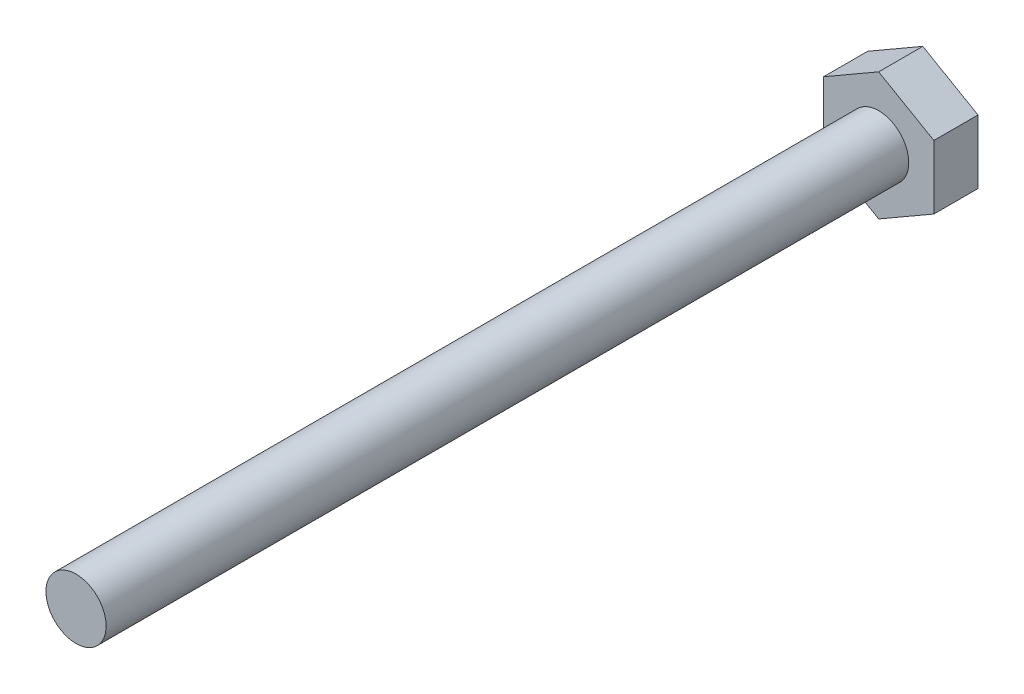
ISO-10303-21;
HEADER;
FILE_DESCRIPTION(('STEP AP214'),'2;1');
FILE_NAME('part.step','',(''),(''),'','','');
FILE_SCHEMA(('AUTOMOTIVE_DESIGN { 1 0 10303 214 1 1 1 1 }'));
ENDSEC;
DATA;
#1=APPLICATION_CONTEXT('core data for automotive mechanical design processes');
#2=APPLICATION_PROTOCOL_DEFINITION('international standard','automotive_design',2000,#1);
#3=PRODUCT_CONTEXT('',#1,'mechanical');
#4=PRODUCT('Part','Part','',(#3));
#5=PRODUCT_RELATED_PRODUCT_CATEGORY('part','',(#4));
#6=PRODUCT_DEFINITION_FORMATION('','',#4);
#7=PRODUCT_DEFINITION_CONTEXT('part definition',#1,'design');
#8=PRODUCT_DEFINITION('design','',#6,#7);
#9=PRODUCT_DEFINITION_SHAPE('','',#8);
#10=(LENGTH_UNIT() NAMED_UNIT(*) SI_UNIT(.MILLI.,.METRE.));
#11=(NAMED_UNIT(*) PLANE_ANGLE_UNIT() SI_UNIT($,.RADIAN.));
#12=(NAMED_UNIT(*) SI_UNIT($,.STERADIAN.) SOLID_ANGLE_UNIT());
#13=UNCERTAINTY_MEASURE_WITH_UNIT(LENGTH_MEASURE(1.E-05),#10,'distance_accuracy_value','');
#14=(GEOMETRIC_REPRESENTATION_CONTEXT(3) GLOBAL_UNCERTAINTY_ASSIGNED_CONTEXT((#13)) GLOBAL_UNIT_ASSIGNED_CONTEXT((#10,
#11,#12)) REPRESENTATION_CONTEXT('',''));
#15=CARTESIAN_POINT('',(0.,0.,0.));
#16=DIRECTION('',(0.,0.,1.));
#17=DIRECTION('',(1.,0.,0.));
#18=AXIS2_PLACEMENT_3D('',#15,#16,#17);
#19=CARTESIAN_POINT('',(-2.75,0.,2.2));
#20=DIRECTION('',(1.,0.,0.));
#21=DIRECTION('',(0.,1.,0.));
#22=AXIS2_PLACEMENT_3D('',#19,#20,#21);
#23=PLANE('',#22);
#24=DIRECTION('',(0.,-1.,0.));
#25=VECTOR('',#24,1.);
#26=CARTESIAN_POINT('',(-2.75,0.,0.));
#27=LINE('',#26,#25);
#28=CARTESIAN_POINT('',(-2.75,1.58771324027147,0.));
#29=VERTEX_POINT('',#28);
#30=CARTESIAN_POINT('',(-2.75,-1.58771324027147,0.));
#31=VERTEX_POINT('',#30);
#32=EDGE_CURVE('E142',#29,#31,#27,.T.);
#33=ORIENTED_EDGE('',*,*,#32,.T.);
#34=DIRECTION('',(0.,0.,-1.));
#35=VECTOR('',#34,1.);
#36=CARTESIAN_POINT('',(-2.75,-1.58771324027147,2.2));
#37=LINE('',#36,#35);
#38=CARTESIAN_POINT('',(-2.75,-1.58771324027147,2.2));
#39=VERTEX_POINT('',#38);
#40=EDGE_CURVE('E171',#39,#31,#37,.T.);
#41=ORIENTED_EDGE('',*,*,#40,.F.);
#42=DIRECTION('',(0.,-1.,0.));
#43=VECTOR('',#42,1.);
#44=CARTESIAN_POINT('',(-2.75,0.,2.2));
#45=LINE('',#44,#43);
#46=CARTESIAN_POINT('',(-2.75,1.58771324027147,2.2));
#47=VERTEX_POINT('',#46);
#48=EDGE_CURVE('E252',#47,#39,#45,.T.);
#49=ORIENTED_EDGE('',*,*,#48,.F.);
#50=DIRECTION('',(0.,0.,-1.));
#51=VECTOR('',#50,1.);
#52=CARTESIAN_POINT('',(-2.75,1.58771324027147,2.2));
#53=LINE('',#52,#51);
#54=EDGE_CURVE('E138',#47,#29,#53,.T.);
#55=ORIENTED_EDGE('',*,*,#54,.T.);
#56=EDGE_LOOP('',(#33,#41,#49,#55));
#57=FACE_BOUND('',#56,.T.);
#58=ADVANCED_FACE('F41',(#57),#23,.F.);
#59=CARTESIAN_POINT('',(-1.375,-2.38156986040721,2.2));
#60=DIRECTION('',(0.5,0.866025403784439,0.));
#61=DIRECTION('',(-0.866025403784439,0.5,0.));
#62=AXIS2_PLACEMENT_3D('',#59,#60,#61);
#63=PLANE('',#62);
#64=DIRECTION('',(0.866025403784439,-0.5,0.));
#65=VECTOR('',#64,1.);
#66=CARTESIAN_POINT('',(-1.375,-2.38156986040721,0.));
#67=LINE('',#66,#65);
#68=CARTESIAN_POINT('',(0.,-3.17542648054294,0.));
#69=VERTEX_POINT('',#68);
#70=EDGE_CURVE('E146',#31,#69,#67,.T.);
#71=ORIENTED_EDGE('',*,*,#70,.T.);
#72=DIRECTION('',(0.,0.,-1.));
#73=VECTOR('',#72,1.);
#74=CARTESIAN_POINT('',(0.,-3.17542648054294,2.2));
#75=LINE('',#74,#73);
#76=CARTESIAN_POINT('',(0.,-3.17542648054294,2.2));
#77=VERTEX_POINT('',#76);
#78=EDGE_CURVE('E167',#77,#69,#75,.T.);
#79=ORIENTED_EDGE('',*,*,#78,.F.);
#80=DIRECTION('',(0.866025403784439,-0.5,0.));
#81=VECTOR('',#80,1.);
#82=CARTESIAN_POINT('',(-1.375,-2.38156986040721,2.2));
#83=LINE('',#82,#81);
#84=EDGE_CURVE('E101',#39,#77,#83,.T.);
#85=ORIENTED_EDGE('',*,*,#84,.F.);
#86=ORIENTED_EDGE('',*,*,#40,.T.);
#87=EDGE_LOOP('',(#71,#79,#85,#86));
#88=FACE_BOUND('',#87,.T.);
#89=ADVANCED_FACE('F259',(#88),#63,.F.);
#90=CARTESIAN_POINT('',(1.375,-2.38156986040721,2.2));
#91=DIRECTION('',(-0.5,0.866025403784439,0.));
#92=DIRECTION('',(-0.866025403784439,-0.5,0.));
#93=AXIS2_PLACEMENT_3D('',#90,#91,#92);
#94=PLANE('',#93);
#95=DIRECTION('',(0.866025403784439,0.5,0.));
#96=VECTOR('',#95,1.);
#97=CARTESIAN_POINT('',(1.375,-2.38156986040721,0.));
#98=LINE('',#97,#96);
#99=CARTESIAN_POINT('',(2.75,-1.58771324027147,0.));
#100=VERTEX_POINT('',#99);
#101=EDGE_CURVE('E150',#69,#100,#98,.T.);
#102=ORIENTED_EDGE('',*,*,#101,.T.);
#103=DIRECTION('',(0.,0.,-1.));
#104=VECTOR('',#103,1.);
#105=CARTESIAN_POINT('',(2.75,-1.58771324027147,2.2));
#106=LINE('',#105,#104);
#107=CARTESIAN_POINT('',(2.75,-1.58771324027147,2.2));
#108=VERTEX_POINT('',#107);
#109=EDGE_CURVE('E131',#108,#100,#106,.T.);
#110=ORIENTED_EDGE('',*,*,#109,.F.);
#111=DIRECTION('',(0.866025403784439,0.5,0.));
#112=VECTOR('',#111,1.);
#113=CARTESIAN_POINT('',(1.375,-2.38156986040721,2.2));
#114=LINE('',#113,#112);
#115=EDGE_CURVE('E117',#77,#108,#114,.T.);
#116=ORIENTED_EDGE('',*,*,#115,.F.);
#117=ORIENTED_EDGE('',*,*,#78,.T.);
#118=EDGE_LOOP('',(#102,#110,#116,#117));
#119=FACE_BOUND('',#118,.T.);
#120=ADVANCED_FACE('F262',(#119),#94,.F.);
#121=CARTESIAN_POINT('',(2.75,0.,2.2));
#122=DIRECTION('',(-1.,0.,0.));
#123=DIRECTION('',(0.,-1.,0.));
#124=AXIS2_PLACEMENT_3D('',#121,#122,#123);
#125=PLANE('',#124);
#126=DIRECTION('',(0.,1.,0.));
#127=VECTOR('',#126,1.);
#128=CARTESIAN_POINT('',(2.75,0.,0.));
#129=LINE('',#128,#127);
#130=CARTESIAN_POINT('',(2.75,1.58771324027147,0.));
#131=VERTEX_POINT('',#130);
#132=EDGE_CURVE('E127',#100,#131,#129,.T.);
#133=ORIENTED_EDGE('',*,*,#132,.T.);
#134=DIRECTION('',(0.,0.,-1.));
#135=VECTOR('',#134,1.);
#136=CARTESIAN_POINT('',(2.75,1.58771324027147,2.2));
#137=LINE('',#136,#135);
#138=CARTESIAN_POINT('',(2.75,1.58771324027147,2.2));
#139=VERTEX_POINT('',#138);
#140=EDGE_CURVE('E124',#139,#131,#137,.T.);
#141=ORIENTED_EDGE('',*,*,#140,.F.);
#142=DIRECTION('',(0.,1.,0.));
#143=VECTOR('',#142,1.);
#144=CARTESIAN_POINT('',(2.75,0.,2.2));
#145=LINE('',#144,#143);
#146=EDGE_CURVE('E110',#108,#139,#145,.T.);
#147=ORIENTED_EDGE('',*,*,#146,.F.);
#148=ORIENTED_EDGE('',*,*,#109,.T.);
#149=EDGE_LOOP('',(#133,#141,#147,#148));
#150=FACE_BOUND('',#149,.T.);
#151=ADVANCED_FACE('F125',(#150),#125,.F.);
#152=CARTESIAN_POINT('',(1.375,2.38156986040721,2.2));
#153=DIRECTION('',(-0.5,-0.866025403784439,0.));
#154=DIRECTION('',(0.866025403784439,-0.5,0.));
#155=AXIS2_PLACEMENT_3D('',#152,#153,#154);
#156=PLANE('',#155);
#157=DIRECTION('',(-0.866025403784439,0.5,0.));
#158=VECTOR('',#157,1.);
#159=CARTESIAN_POINT('',(1.375,2.38156986040721,0.));
#160=LINE('',#159,#158);
#161=CARTESIAN_POINT('',(0.,3.17542648054294,0.));
#162=VERTEX_POINT('',#161);
#163=EDGE_CURVE('E155',#131,#162,#160,.T.);
#164=ORIENTED_EDGE('',*,*,#163,.T.);
#165=DIRECTION('',(0.,0.,-1.));
#166=VECTOR('',#165,1.);
#167=CARTESIAN_POINT('',(0.,3.17542648054294,2.2));
#168=LINE('',#167,#166);
#169=CARTESIAN_POINT('',(0.,3.17542648054294,2.2));
#170=VERTEX_POINT('',#169);
#171=EDGE_CURVE('E132',#170,#162,#168,.T.);
#172=ORIENTED_EDGE('',*,*,#171,.F.);
#173=DIRECTION('',(-0.866025403784439,0.5,0.));
#174=VECTOR('',#173,1.);
#175=CARTESIAN_POINT('',(1.375,2.38156986040721,2.2));
#176=LINE('',#175,#174);
#177=EDGE_CURVE('E114',#139,#170,#176,.T.);
#178=ORIENTED_EDGE('',*,*,#177,.F.);
#179=ORIENTED_EDGE('',*,*,#140,.T.);
#180=EDGE_LOOP('',(#164,#172,#178,#179));
#181=FACE_BOUND('',#180,.T.);
#182=ADVANCED_FACE('F134',(#181),#156,.F.);
#183=CARTESIAN_POINT('',(-1.375,2.38156986040721,2.2));
#184=DIRECTION('',(0.5,-0.866025403784439,0.));
#185=DIRECTION('',(0.866025403784439,0.5,0.));
#186=AXIS2_PLACEMENT_3D('',#183,#184,#185);
#187=PLANE('',#186);
#188=DIRECTION('',(-0.866025403784439,-0.5,0.));
#189=VECTOR('',#188,1.);
#190=CARTESIAN_POINT('',(-1.375,2.38156986040721,0.));
#191=LINE('',#190,#189);
#192=EDGE_CURVE('E92',#162,#29,#191,.T.);
#193=ORIENTED_EDGE('',*,*,#192,.T.);
#194=ORIENTED_EDGE('',*,*,#54,.F.);
#195=DIRECTION('',(-0.866025403784439,-0.5,0.));
#196=VECTOR('',#195,1.);
#197=CARTESIAN_POINT('',(-1.375,2.38156986040721,2.2));
#198=LINE('',#197,#196);
#199=EDGE_CURVE('E65',#170,#47,#198,.T.);
#200=ORIENTED_EDGE('',*,*,#199,.F.);
#201=ORIENTED_EDGE('',*,*,#171,.T.);
#202=EDGE_LOOP('',(#193,#194,#200,#201));
#203=FACE_BOUND('',#202,.T.);
#204=ADVANCED_FACE('F264',(#203),#187,.F.);
#205=CARTESIAN_POINT('',(0.,0.,2.2));
#206=DIRECTION('',(0.,0.,1.));
#207=DIRECTION('',(1.,0.,0.));
#208=AXIS2_PLACEMENT_3D('',#205,#206,#207);
#209=PLANE('',#208);
#210=CARTESIAN_POINT('',(0.,0.,2.2));
#211=DIRECTION('',(0.,0.,1.));
#212=DIRECTION('',(1.,0.,0.));
#213=AXIS2_PLACEMENT_3D('',#210,#211,#212);
#214=CIRCLE('',#213,1.5);
#215=CARTESIAN_POINT('',(1.5,0.,2.2));
#216=VERTEX_POINT('',#215);
#217=EDGE_CURVE('E160',#216,#216,#214,.T.);
#218=ORIENTED_EDGE('',*,*,#217,.F.);
#219=EDGE_LOOP('',(#218));
#220=FACE_BOUND('',#219,.T.);
#221=ORIENTED_EDGE('',*,*,#48,.T.);
#222=ORIENTED_EDGE('',*,*,#84,.T.);
#223=ORIENTED_EDGE('',*,*,#115,.T.);
#224=ORIENTED_EDGE('',*,*,#146,.T.);
#225=ORIENTED_EDGE('',*,*,#177,.T.);
#226=ORIENTED_EDGE('',*,*,#199,.T.);
#227=EDGE_LOOP('',(#221,#222,#223,#224,#225,#226));
#228=FACE_BOUND('',#227,.T.);
#229=ADVANCED_FACE('F112',(#220,#228),#209,.T.);
#230=CARTESIAN_POINT('',(0.,0.,0.));
#231=DIRECTION('',(0.,0.,1.));
#232=DIRECTION('',(1.,0.,0.));
#233=AXIS2_PLACEMENT_3D('',#230,#231,#232);
#234=PLANE('',#233);
#235=DIRECTION('',(0.,1.,0.));
#236=VECTOR('',#235,1.);
#237=CARTESIAN_POINT('',(-0.902887914256968,0.,0.));
#238=LINE('',#237,#236);
#239=CARTESIAN_POINT('',(-0.902887914256968,-0.249002883628349,0.));
#240=VERTEX_POINT('',#239);
#241=CARTESIAN_POINT('',(-0.902887914256968,0.249002883628349,0.));
#242=VERTEX_POINT('',#241);
#243=EDGE_CURVE('E174',#240,#242,#238,.T.);
#244=ORIENTED_EDGE('',*,*,#243,.F.);
#245=DIRECTION('',(1.,0.,0.));
#246=VECTOR('',#245,1.);
#247=CARTESIAN_POINT('',(0.,-0.24900288362835,0.));
#248=LINE('',#247,#246);
#249=CARTESIAN_POINT('',(-0.249002883628348,-0.24900288362835,0.));
#250=VERTEX_POINT('',#249);
#251=EDGE_CURVE('E11',#240,#250,#248,.T.);
#252=ORIENTED_EDGE('',*,*,#251,.T.);
#253=DIRECTION('',(0.,-1.,0.));
#254=VECTOR('',#253,1.);
#255=CARTESIAN_POINT('',(-0.249002883628347,0.,0.));
#256=LINE('',#255,#254);
#257=CARTESIAN_POINT('',(-0.249002883628348,-0.902887914256969,0.));
#258=VERTEX_POINT('',#257);
#259=EDGE_CURVE('E49',#250,#258,#256,.T.);
#260=ORIENTED_EDGE('',*,*,#259,.T.);
#261=DIRECTION('',(1.,0.,0.));
#262=VECTOR('',#261,1.);
#263=CARTESIAN_POINT('',(0.,-0.902887914256969,0.));
#264=LINE('',#263,#262);
#265=CARTESIAN_POINT('',(0.24900288362835,-0.902887914256969,0.));
#266=VERTEX_POINT('',#265);
#267=EDGE_CURVE('E209',#258,#266,#264,.T.);
#268=ORIENTED_EDGE('',*,*,#267,.T.);
#269=DIRECTION('',(0.,-1.,0.));
#270=VECTOR('',#269,1.);
#271=CARTESIAN_POINT('',(0.249002883628349,0.,0.));
#272=LINE('',#271,#270);
#273=CARTESIAN_POINT('',(0.249002883628349,-0.249002883628349,0.));
#274=VERTEX_POINT('',#273);
#275=EDGE_CURVE('E205',#274,#266,#272,.T.);
#276=ORIENTED_EDGE('',*,*,#275,.F.);
#277=DIRECTION('',(-1.,0.,0.));
#278=VECTOR('',#277,1.);
#279=CARTESIAN_POINT('',(0.,-0.24900288362835,0.));
#280=LINE('',#279,#278);
#281=CARTESIAN_POINT('',(0.90288791425697,-0.249002883628349,0.));
#282=VERTEX_POINT('',#281);
#283=EDGE_CURVE('E201',#282,#274,#280,.T.);
#284=ORIENTED_EDGE('',*,*,#283,.F.);
#285=DIRECTION('',(0.,1.,0.));
#286=VECTOR('',#285,1.);
#287=CARTESIAN_POINT('',(0.90288791425697,0.,0.));
#288=LINE('',#287,#286);
#289=CARTESIAN_POINT('',(0.90288791425697,0.249002883628349,0.));
#290=VERTEX_POINT('',#289);
#291=EDGE_CURVE('E197',#282,#290,#288,.T.);
#292=ORIENTED_EDGE('',*,*,#291,.T.);
#293=DIRECTION('',(-1.,0.,0.));
#294=VECTOR('',#293,1.);
#295=CARTESIAN_POINT('',(0.,0.24900288362835,0.));
#296=LINE('',#295,#294);
#297=CARTESIAN_POINT('',(0.249002883628349,0.249002883628349,0.));
#298=VERTEX_POINT('',#297);
#299=EDGE_CURVE('E193',#290,#298,#296,.T.);
#300=ORIENTED_EDGE('',*,*,#299,.T.);
#301=DIRECTION('',(0.,1.,0.));
#302=VECTOR('',#301,1.);
#303=CARTESIAN_POINT('',(0.249002883628349,0.,0.));
#304=LINE('',#303,#302);
#305=CARTESIAN_POINT('',(0.24900288362835,0.902887914256969,0.));
#306=VERTEX_POINT('',#305);
#307=EDGE_CURVE('E189',#298,#306,#304,.T.);
#308=ORIENTED_EDGE('',*,*,#307,.T.);
#309=DIRECTION('',(1.,0.,0.));
#310=VECTOR('',#309,1.);
#311=CARTESIAN_POINT('',(0.,0.902887914256969,0.));
#312=LINE('',#311,#310);
#313=CARTESIAN_POINT('',(-0.249002883628348,0.902887914256969,0.));
#314=VERTEX_POINT('',#313);
#315=EDGE_CURVE('E185',#314,#306,#312,.T.);
#316=ORIENTED_EDGE('',*,*,#315,.F.);
#317=DIRECTION('',(0.,1.,0.));
#318=VECTOR('',#317,1.);
#319=CARTESIAN_POINT('',(-0.249002883628348,0.,0.));
#320=LINE('',#319,#318);
#321=CARTESIAN_POINT('',(-0.249002883628348,0.249002883628349,0.));
#322=VERTEX_POINT('',#321);
#323=EDGE_CURVE('E181',#322,#314,#320,.T.);
#324=ORIENTED_EDGE('',*,*,#323,.F.);
#325=DIRECTION('',(1.,0.,0.));
#326=VECTOR('',#325,1.);
#327=CARTESIAN_POINT('',(0.,0.24900288362835,0.));
#328=LINE('',#327,#326);
#329=EDGE_CURVE('E177',#242,#322,#328,.T.);
#330=ORIENTED_EDGE('',*,*,#329,.F.);
#331=EDGE_LOOP('',(#244,#252,#260,#268,#276,#284,#292,#300,#308,#316,#324,#330));
#332=FACE_BOUND('',#331,.T.);
#333=ORIENTED_EDGE('',*,*,#32,.F.);
#334=ORIENTED_EDGE('',*,*,#192,.F.);
#335=ORIENTED_EDGE('',*,*,#163,.F.);
#336=ORIENTED_EDGE('',*,*,#132,.F.);
#337=ORIENTED_EDGE('',*,*,#101,.F.);
#338=ORIENTED_EDGE('',*,*,#70,.F.);
#339=EDGE_LOOP('',(#333,#334,#335,#336,#337,#338));
#340=FACE_BOUND('',#339,.T.);
#341=ADVANCED_FACE('F218',(#332,#340),#234,.F.);
#342=CARTESIAN_POINT('',(0.,0.,42.2));
#343=DIRECTION('',(0.,0.,-1.));
#344=DIRECTION('',(-1.,0.,0.));
#345=AXIS2_PLACEMENT_3D('',#342,#343,#344);
#346=CYLINDRICAL_SURFACE('',#345,1.5);
#347=ORIENTED_EDGE('',*,*,#217,.T.);
#348=EDGE_LOOP('',(#347));
#349=FACE_BOUND('',#348,.T.);
#350=CARTESIAN_POINT('',(0.,0.,42.2));
#351=DIRECTION('',(0.,0.,1.));
#352=DIRECTION('',(1.,0.,0.));
#353=AXIS2_PLACEMENT_3D('',#350,#351,#352);
#354=CIRCLE('',#353,1.5);
#355=CARTESIAN_POINT('',(1.5,0.,42.2));
#356=VERTEX_POINT('',#355);
#357=EDGE_CURVE('E147',#356,#356,#354,.T.);
#358=ORIENTED_EDGE('',*,*,#357,.F.);
#359=EDGE_LOOP('',(#358));
#360=FACE_BOUND('',#359,.T.);
#361=ADVANCED_FACE('F283',(#349,#360),#346,.T.);
#362=CARTESIAN_POINT('',(0.,0.,42.2));
#363=DIRECTION('',(0.,0.,1.));
#364=DIRECTION('',(1.,0.,0.));
#365=AXIS2_PLACEMENT_3D('',#362,#363,#364);
#366=PLANE('',#365);
#367=ORIENTED_EDGE('',*,*,#357,.T.);
#368=EDGE_LOOP('',(#367));
#369=FACE_BOUND('',#368,.T.);
#370=ADVANCED_FACE('F289',(#369),#366,.T.);
#371=CARTESIAN_POINT('',(0.,-0.24900288362835,1.));
#372=DIRECTION('',(0.,-1.,0.));
#373=DIRECTION('',(1.,0.,0.));
#374=AXIS2_PLACEMENT_3D('',#371,#372,#373);
#375=PLANE('',#374);
#376=DIRECTION('',(0.,0.,-1.));
#377=VECTOR('',#376,1.);
#378=CARTESIAN_POINT('',(-0.902887914256968,-0.249002883628349,1.));
#379=LINE('',#378,#377);
#380=CARTESIAN_POINT('',(-0.902887914256968,-0.249002883628349,1.));
#381=VERTEX_POINT('',#380);
#382=EDGE_CURVE('E56',#381,#240,#379,.T.);
#383=ORIENTED_EDGE('',*,*,#382,.F.);
#384=DIRECTION('',(-1.,0.,0.));
#385=VECTOR('',#384,1.);
#386=CARTESIAN_POINT('',(0.,-0.24900288362835,1.));
#387=LINE('',#386,#385);
#388=CARTESIAN_POINT('',(-0.249002883628348,-0.24900288362835,1.));
#389=VERTEX_POINT('',#388);
#390=EDGE_CURVE('E237',#389,#381,#387,.T.);
#391=ORIENTED_EDGE('',*,*,#390,.F.);
#392=DIRECTION('',(0.,0.,-1.));
#393=VECTOR('',#392,1.);
#394=CARTESIAN_POINT('',(-0.249002883628348,-0.24900288362835,1.));
#395=LINE('',#394,#393);
#396=EDGE_CURVE('E230',#389,#250,#395,.T.);
#397=ORIENTED_EDGE('',*,*,#396,.T.);
#398=ORIENTED_EDGE('',*,*,#251,.F.);
#399=EDGE_LOOP('',(#383,#391,#397,#398));
#400=FACE_BOUND('',#399,.T.);
#401=ADVANCED_FACE('F235',(#400),#375,.F.);
#402=CARTESIAN_POINT('',(-0.249002883628347,0.,1.));
#403=DIRECTION('',(-1.,0.,0.));
#404=DIRECTION('',(0.,-1.,0.));
#405=AXIS2_PLACEMENT_3D('',#402,#403,#404);
#406=PLANE('',#405);
#407=ORIENTED_EDGE('',*,*,#396,.F.);
#408=DIRECTION('',(0.,1.,0.));
#409=VECTOR('',#408,1.);
#410=CARTESIAN_POINT('',(-0.249002883628347,0.,1.));
#411=LINE('',#410,#409);
#412=CARTESIAN_POINT('',(-0.249002883628348,-0.902887914256969,1.));
#413=VERTEX_POINT('',#412);
#414=EDGE_CURVE('E348',#413,#389,#411,.T.);
#415=ORIENTED_EDGE('',*,*,#414,.F.);
#416=DIRECTION('',(0.,0.,-1.));
#417=VECTOR('',#416,1.);
#418=CARTESIAN_POINT('',(-0.249002883628348,-0.902887914256969,1.));
#419=LINE('',#418,#417);
#420=EDGE_CURVE('E233',#413,#258,#419,.T.);
#421=ORIENTED_EDGE('',*,*,#420,.T.);
#422=ORIENTED_EDGE('',*,*,#259,.F.);
#423=EDGE_LOOP('',(#407,#415,#421,#422));
#424=FACE_BOUND('',#423,.T.);
#425=ADVANCED_FACE('F227',(#424),#406,.F.);
#426=CARTESIAN_POINT('',(0.,-0.902887914256969,1.));
#427=DIRECTION('',(0.,-1.,0.));
#428=DIRECTION('',(1.,0.,0.));
#429=AXIS2_PLACEMENT_3D('',#426,#427,#428);
#430=PLANE('',#429);
#431=ORIENTED_EDGE('',*,*,#420,.F.);
#432=DIRECTION('',(-1.,0.,0.));
#433=VECTOR('',#432,1.);
#434=CARTESIAN_POINT('',(0.,-0.902887914256969,1.));
#435=LINE('',#434,#433);
#436=CARTESIAN_POINT('',(0.24900288362835,-0.902887914256969,1.));
#437=VERTEX_POINT('',#436);
#438=EDGE_CURVE('E354',#437,#413,#435,.T.);
#439=ORIENTED_EDGE('',*,*,#438,.F.);
#440=DIRECTION('',(0.,0.,-1.));
#441=VECTOR('',#440,1.);
#442=CARTESIAN_POINT('',(0.24900288362835,-0.902887914256969,1.));
#443=LINE('',#442,#441);
#444=EDGE_CURVE('E245',#437,#266,#443,.T.);
#445=ORIENTED_EDGE('',*,*,#444,.T.);
#446=ORIENTED_EDGE('',*,*,#267,.F.);
#447=EDGE_LOOP('',(#431,#439,#445,#446));
#448=FACE_BOUND('',#447,.T.);
#449=ADVANCED_FACE('F298',(#448),#430,.F.);
#450=CARTESIAN_POINT('',(0.249002883628349,0.,1.));
#451=DIRECTION('',(-1.,0.,0.));
#452=DIRECTION('',(0.,-1.,0.));
#453=AXIS2_PLACEMENT_3D('',#450,#451,#452);
#454=PLANE('',#453);
#455=ORIENTED_EDGE('',*,*,#275,.T.);
#456=ORIENTED_EDGE('',*,*,#444,.F.);
#457=DIRECTION('',(0.,1.,0.));
#458=VECTOR('',#457,1.);
#459=CARTESIAN_POINT('',(0.249002883628349,0.,1.));
#460=LINE('',#459,#458);
#461=CARTESIAN_POINT('',(0.249002883628349,-0.249002883628349,1.));
#462=VERTEX_POINT('',#461);
#463=EDGE_CURVE('E359',#437,#462,#460,.T.);
#464=ORIENTED_EDGE('',*,*,#463,.T.);
#465=DIRECTION('',(0.,0.,-1.));
#466=VECTOR('',#465,1.);
#467=CARTESIAN_POINT('',(0.249002883628349,-0.249002883628349,1.));
#468=LINE('',#467,#466);
#469=EDGE_CURVE('E423',#462,#274,#468,.T.);
#470=ORIENTED_EDGE('',*,*,#469,.T.);
#471=EDGE_LOOP('',(#455,#456,#464,#470));
#472=FACE_BOUND('',#471,.T.);
#473=ADVANCED_FACE('F301',(#472),#454,.T.);
#474=CARTESIAN_POINT('',(0.,-0.24900288362835,1.));
#475=DIRECTION('',(0.,1.,0.));
#476=DIRECTION('',(-1.,0.,0.));
#477=AXIS2_PLACEMENT_3D('',#474,#475,#476);
#478=PLANE('',#477);
#479=ORIENTED_EDGE('',*,*,#283,.T.);
#480=ORIENTED_EDGE('',*,*,#469,.F.);
#481=DIRECTION('',(1.,0.,0.));
#482=VECTOR('',#481,1.);
#483=CARTESIAN_POINT('',(0.,-0.24900288362835,1.));
#484=LINE('',#483,#482);
#485=CARTESIAN_POINT('',(0.90288791425697,-0.249002883628349,1.));
#486=VERTEX_POINT('',#485);
#487=EDGE_CURVE('E363',#462,#486,#484,.T.);
#488=ORIENTED_EDGE('',*,*,#487,.T.);
#489=DIRECTION('',(0.,0.,-1.));
#490=VECTOR('',#489,1.);
#491=CARTESIAN_POINT('',(0.90288791425697,-0.249002883628349,1.));
#492=LINE('',#491,#490);
#493=EDGE_CURVE('E419',#486,#282,#492,.T.);
#494=ORIENTED_EDGE('',*,*,#493,.T.);
#495=EDGE_LOOP('',(#479,#480,#488,#494));
#496=FACE_BOUND('',#495,.T.);
#497=ADVANCED_FACE('F305',(#496),#478,.T.);
#498=CARTESIAN_POINT('',(0.90288791425697,0.,1.));
#499=DIRECTION('',(1.,0.,0.));
#500=DIRECTION('',(0.,0.,-1.));
#501=AXIS2_PLACEMENT_3D('',#498,#499,#500);
#502=PLANE('',#501);
#503=ORIENTED_EDGE('',*,*,#493,.F.);
#504=DIRECTION('',(0.,-1.,0.));
#505=VECTOR('',#504,1.);
#506=CARTESIAN_POINT('',(0.90288791425697,0.,1.));
#507=LINE('',#506,#505);
#508=CARTESIAN_POINT('',(0.90288791425697,0.249002883628349,1.));
#509=VERTEX_POINT('',#508);
#510=EDGE_CURVE('E367',#509,#486,#507,.T.);
#511=ORIENTED_EDGE('',*,*,#510,.F.);
#512=DIRECTION('',(0.,0.,-1.));
#513=VECTOR('',#512,1.);
#514=CARTESIAN_POINT('',(0.90288791425697,0.249002883628349,1.));
#515=LINE('',#514,#513);
#516=EDGE_CURVE('E415',#509,#290,#515,.T.);
#517=ORIENTED_EDGE('',*,*,#516,.T.);
#518=ORIENTED_EDGE('',*,*,#291,.F.);
#519=EDGE_LOOP('',(#503,#511,#517,#518));
#520=FACE_BOUND('',#519,.T.);
#521=ADVANCED_FACE('F309',(#520),#502,.F.);
#522=CARTESIAN_POINT('',(0.,0.24900288362835,1.));
#523=DIRECTION('',(0.,1.,0.));
#524=DIRECTION('',(-1.,0.,0.));
#525=AXIS2_PLACEMENT_3D('',#522,#523,#524);
#526=PLANE('',#525);
#527=ORIENTED_EDGE('',*,*,#516,.F.);
#528=DIRECTION('',(1.,0.,0.));
#529=VECTOR('',#528,1.);
#530=CARTESIAN_POINT('',(0.,0.24900288362835,1.));
#531=LINE('',#530,#529);
#532=CARTESIAN_POINT('',(0.249002883628349,0.249002883628349,1.));
#533=VERTEX_POINT('',#532);
#534=EDGE_CURVE('E371',#533,#509,#531,.T.);
#535=ORIENTED_EDGE('',*,*,#534,.F.);
#536=DIRECTION('',(0.,0.,-1.));
#537=VECTOR('',#536,1.);
#538=CARTESIAN_POINT('',(0.249002883628349,0.249002883628349,1.));
#539=LINE('',#538,#537);
#540=EDGE_CURVE('E411',#533,#298,#539,.T.);
#541=ORIENTED_EDGE('',*,*,#540,.T.);
#542=ORIENTED_EDGE('',*,*,#299,.F.);
#543=EDGE_LOOP('',(#527,#535,#541,#542));
#544=FACE_BOUND('',#543,.T.);
#545=ADVANCED_FACE('F313',(#544),#526,.F.);
#546=CARTESIAN_POINT('',(0.249002883628349,0.,1.));
#547=DIRECTION('',(1.,0.,0.));
#548=DIRECTION('',(0.,1.,0.));
#549=AXIS2_PLACEMENT_3D('',#546,#547,#548);
#550=PLANE('',#549);
#551=ORIENTED_EDGE('',*,*,#540,.F.);
#552=DIRECTION('',(0.,-1.,0.));
#553=VECTOR('',#552,1.);
#554=CARTESIAN_POINT('',(0.249002883628349,0.,1.));
#555=LINE('',#554,#553);
#556=CARTESIAN_POINT('',(0.24900288362835,0.902887914256969,1.));
#557=VERTEX_POINT('',#556);
#558=EDGE_CURVE('E375',#557,#533,#555,.T.);
#559=ORIENTED_EDGE('',*,*,#558,.F.);
#560=DIRECTION('',(0.,0.,-1.));
#561=VECTOR('',#560,1.);
#562=CARTESIAN_POINT('',(0.24900288362835,0.902887914256969,1.));
#563=LINE('',#562,#561);
#564=EDGE_CURVE('E407',#557,#306,#563,.T.);
#565=ORIENTED_EDGE('',*,*,#564,.T.);
#566=ORIENTED_EDGE('',*,*,#307,.F.);
#567=EDGE_LOOP('',(#551,#559,#565,#566));
#568=FACE_BOUND('',#567,.T.);
#569=ADVANCED_FACE('F317',(#568),#550,.F.);
#570=CARTESIAN_POINT('',(0.,0.902887914256969,1.));
#571=DIRECTION('',(0.,-1.,0.));
#572=DIRECTION('',(1.,0.,0.));
#573=AXIS2_PLACEMENT_3D('',#570,#571,#572);
#574=PLANE('',#573);
#575=ORIENTED_EDGE('',*,*,#315,.T.);
#576=ORIENTED_EDGE('',*,*,#564,.F.);
#577=DIRECTION('',(-1.,0.,0.));
#578=VECTOR('',#577,1.);
#579=CARTESIAN_POINT('',(0.,0.902887914256969,1.));
#580=LINE('',#579,#578);
#581=CARTESIAN_POINT('',(-0.249002883628348,0.902887914256969,1.));
#582=VERTEX_POINT('',#581);
#583=EDGE_CURVE('E379',#557,#582,#580,.T.);
#584=ORIENTED_EDGE('',*,*,#583,.T.);
#585=DIRECTION('',(0.,0.,-1.));
#586=VECTOR('',#585,1.);
#587=CARTESIAN_POINT('',(-0.249002883628348,0.902887914256969,1.));
#588=LINE('',#587,#586);
#589=EDGE_CURVE('E403',#582,#314,#588,.T.);
#590=ORIENTED_EDGE('',*,*,#589,.T.);
#591=EDGE_LOOP('',(#575,#576,#584,#590));
#592=FACE_BOUND('',#591,.T.);
#593=ADVANCED_FACE('F321',(#592),#574,.T.);
#594=CARTESIAN_POINT('',(-0.249002883628348,0.,1.));
#595=DIRECTION('',(1.,0.,0.));
#596=DIRECTION('',(0.,1.,0.));
#597=AXIS2_PLACEMENT_3D('',#594,#595,#596);
#598=PLANE('',#597);
#599=ORIENTED_EDGE('',*,*,#323,.T.);
#600=ORIENTED_EDGE('',*,*,#589,.F.);
#601=DIRECTION('',(0.,-1.,0.));
#602=VECTOR('',#601,1.);
#603=CARTESIAN_POINT('',(-0.249002883628348,0.,1.));
#604=LINE('',#603,#602);
#605=CARTESIAN_POINT('',(-0.249002883628348,0.249002883628349,1.));
#606=VERTEX_POINT('',#605);
#607=EDGE_CURVE('E383',#582,#606,#604,.T.);
#608=ORIENTED_EDGE('',*,*,#607,.T.);
#609=DIRECTION('',(0.,0.,-1.));
#610=VECTOR('',#609,1.);
#611=CARTESIAN_POINT('',(-0.249002883628348,0.249002883628349,1.));
#612=LINE('',#611,#610);
#613=EDGE_CURVE('E399',#606,#322,#612,.T.);
#614=ORIENTED_EDGE('',*,*,#613,.T.);
#615=EDGE_LOOP('',(#599,#600,#608,#614));
#616=FACE_BOUND('',#615,.T.);
#617=ADVANCED_FACE('F325',(#616),#598,.T.);
#618=CARTESIAN_POINT('',(0.,0.24900288362835,1.));
#619=DIRECTION('',(0.,-1.,0.));
#620=DIRECTION('',(1.,0.,0.));
#621=AXIS2_PLACEMENT_3D('',#618,#619,#620);
#622=PLANE('',#621);
#623=ORIENTED_EDGE('',*,*,#329,.T.);
#624=ORIENTED_EDGE('',*,*,#613,.F.);
#625=DIRECTION('',(-1.,0.,0.));
#626=VECTOR('',#625,1.);
#627=CARTESIAN_POINT('',(0.,0.24900288362835,1.));
#628=LINE('',#627,#626);
#629=CARTESIAN_POINT('',(-0.902887914256968,0.249002883628349,1.));
#630=VERTEX_POINT('',#629);
#631=EDGE_CURVE('E387',#606,#630,#628,.T.);
#632=ORIENTED_EDGE('',*,*,#631,.T.);
#633=DIRECTION('',(0.,0.,-1.));
#634=VECTOR('',#633,1.);
#635=CARTESIAN_POINT('',(-0.902887914256968,0.249002883628349,1.));
#636=LINE('',#635,#634);
#637=EDGE_CURVE('E395',#630,#242,#636,.T.);
#638=ORIENTED_EDGE('',*,*,#637,.T.);
#639=EDGE_LOOP('',(#623,#624,#632,#638));
#640=FACE_BOUND('',#639,.T.);
#641=ADVANCED_FACE('F329',(#640),#622,.T.);
#642=CARTESIAN_POINT('',(-0.902887914256968,0.,1.));
#643=DIRECTION('',(1.,0.,0.));
#644=DIRECTION('',(0.,0.,-1.));
#645=AXIS2_PLACEMENT_3D('',#642,#643,#644);
#646=PLANE('',#645);
#647=ORIENTED_EDGE('',*,*,#243,.T.);
#648=ORIENTED_EDGE('',*,*,#637,.F.);
#649=DIRECTION('',(0.,-1.,0.));
#650=VECTOR('',#649,1.);
#651=CARTESIAN_POINT('',(-0.902887914256968,0.,1.));
#652=LINE('',#651,#650);
#653=EDGE_CURVE('E346',#630,#381,#652,.T.);
#654=ORIENTED_EDGE('',*,*,#653,.T.);
#655=ORIENTED_EDGE('',*,*,#382,.T.);
#656=EDGE_LOOP('',(#647,#648,#654,#655));
#657=FACE_BOUND('',#656,.T.);
#658=ADVANCED_FACE('F333',(#657),#646,.T.);
#659=CARTESIAN_POINT('',(0.,0.,1.));
#660=DIRECTION('',(0.,0.,1.));
#661=DIRECTION('',(1.,0.,0.));
#662=AXIS2_PLACEMENT_3D('',#659,#660,#661);
#663=PLANE('',#662);
#664=ORIENTED_EDGE('',*,*,#390,.T.);
#665=ORIENTED_EDGE('',*,*,#653,.F.);
#666=ORIENTED_EDGE('',*,*,#631,.F.);
#667=ORIENTED_EDGE('',*,*,#607,.F.);
#668=ORIENTED_EDGE('',*,*,#583,.F.);
#669=ORIENTED_EDGE('',*,*,#558,.T.);
#670=ORIENTED_EDGE('',*,*,#534,.T.);
#671=ORIENTED_EDGE('',*,*,#510,.T.);
#672=ORIENTED_EDGE('',*,*,#487,.F.);
#673=ORIENTED_EDGE('',*,*,#463,.F.);
#674=ORIENTED_EDGE('',*,*,#438,.T.);
#675=ORIENTED_EDGE('',*,*,#414,.T.);
#676=EDGE_LOOP('',(#664,#665,#666,#667,#668,#669,#670,#671,#672,#673,#674,#675));
#677=FACE_BOUND('',#676,.T.);
#678=ADVANCED_FACE('F337',(#677),#663,.F.);
#679=CLOSED_SHELL('',(#58,#89,#120,#151,#182,#204,#229,#341,#361,#370,#401,#425,#449,#473,#497,
#521,#545,#569,#593,#617,#641,#658,#678));
#680=MANIFOLD_SOLID_BREP('B2',#679);
#681=ADVANCED_BREP_SHAPE_REPRESENTATION('',(#18,#680),#14);
#682=SHAPE_DEFINITION_REPRESENTATION(#9,#681);
ENDSEC;
END-ISO-10303-21;
